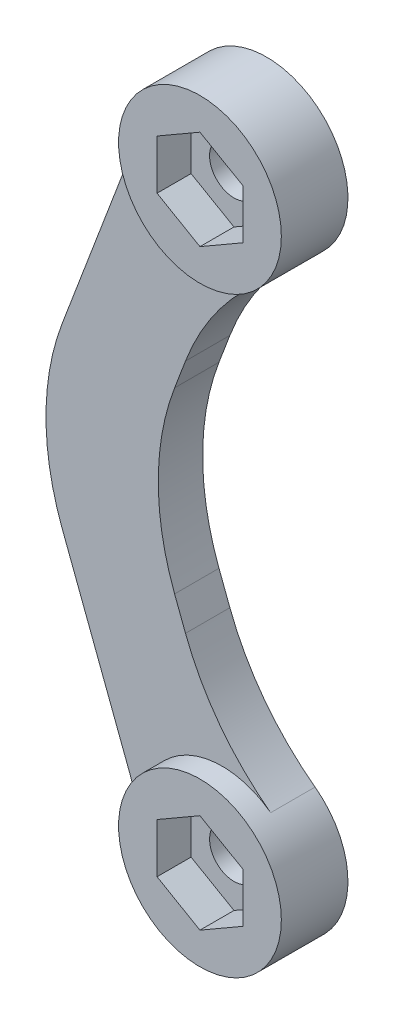
ISO-10303-21;
HEADER;
FILE_DESCRIPTION(('STEP AP214'),'2;1');
FILE_NAME('part.step','',(''),(''),'','','');
FILE_SCHEMA(('AUTOMOTIVE_DESIGN { 1 0 10303 214 1 1 1 1 }'));
ENDSEC;
DATA;
#1=APPLICATION_CONTEXT('core data for automotive mechanical design processes');
#2=APPLICATION_PROTOCOL_DEFINITION('international standard','automotive_design',2000,#1);
#3=PRODUCT_CONTEXT('',#1,'mechanical');
#4=PRODUCT('Part','Part','',(#3));
#5=PRODUCT_RELATED_PRODUCT_CATEGORY('part','',(#4));
#6=PRODUCT_DEFINITION_FORMATION('','',#4);
#7=PRODUCT_DEFINITION_CONTEXT('part definition',#1,'design');
#8=PRODUCT_DEFINITION('design','',#6,#7);
#9=PRODUCT_DEFINITION_SHAPE('','',#8);
#10=(LENGTH_UNIT() NAMED_UNIT(*) SI_UNIT(.MILLI.,.METRE.));
#11=(NAMED_UNIT(*) PLANE_ANGLE_UNIT() SI_UNIT($,.RADIAN.));
#12=(NAMED_UNIT(*) SI_UNIT($,.STERADIAN.) SOLID_ANGLE_UNIT());
#13=UNCERTAINTY_MEASURE_WITH_UNIT(LENGTH_MEASURE(1.E-05),#10,'distance_accuracy_value','');
#14=(GEOMETRIC_REPRESENTATION_CONTEXT(3) GLOBAL_UNCERTAINTY_ASSIGNED_CONTEXT((#13)) GLOBAL_UNIT_ASSIGNED_CONTEXT((#10,
#11,#12)) REPRESENTATION_CONTEXT('',''));
#15=CARTESIAN_POINT('',(0.,0.,0.));
#16=DIRECTION('',(0.,0.,1.));
#17=DIRECTION('',(1.,0.,0.));
#18=AXIS2_PLACEMENT_3D('',#15,#16,#17);
#19=CARTESIAN_POINT('',(0.412251729944696,-21.2160709251314,3.));
#20=DIRECTION('',(0.,0.,-1.));
#21=DIRECTION('',(-1.,0.,0.));
#22=AXIS2_PLACEMENT_3D('',#19,#20,#21);
#23=CYLINDRICAL_SURFACE('',#22,1.65);
#24=CARTESIAN_POINT('',(0.412251729944696,-21.2160709251314,0.));
#25=DIRECTION('',(0.,0.,1.));
#26=DIRECTION('',(1.,0.,0.));
#27=AXIS2_PLACEMENT_3D('',#24,#25,#26);
#28=CIRCLE('',#27,1.65);
#29=CARTESIAN_POINT('',(2.06225172994469,-21.2160709251314,0.));
#30=VERTEX_POINT('',#29);
#31=EDGE_CURVE('E309',#30,#30,#28,.T.);
#32=ORIENTED_EDGE('',*,*,#31,.F.);
#33=EDGE_LOOP('',(#32));
#34=FACE_BOUND('',#33,.T.);
#35=CARTESIAN_POINT('',(0.412251729944696,-21.2160709251314,2.2));
#36=DIRECTION('',(0.,0.,1.));
#37=DIRECTION('',(1.,0.,0.));
#38=AXIS2_PLACEMENT_3D('',#35,#36,#37);
#39=CIRCLE('',#38,1.65);
#40=CARTESIAN_POINT('',(2.06225172994469,-21.2160709251314,2.2));
#41=VERTEX_POINT('',#40);
#42=EDGE_CURVE('E253',#41,#41,#39,.T.);
#43=ORIENTED_EDGE('',*,*,#42,.T.);
#44=EDGE_LOOP('',(#43));
#45=FACE_BOUND('',#44,.T.);
#46=ADVANCED_FACE('F35',(#34,#45),#23,.F.);
#47=CARTESIAN_POINT('',(0.412251729944696,18.7839290748686,3.));
#48=DIRECTION('',(0.,0.,-1.));
#49=DIRECTION('',(-1.,0.,0.));
#50=AXIS2_PLACEMENT_3D('',#47,#48,#49);
#51=CYLINDRICAL_SURFACE('',#50,1.65);
#52=CARTESIAN_POINT('',(0.412251729944696,18.7839290748686,0.));
#53=DIRECTION('',(0.,0.,1.));
#54=DIRECTION('',(-1.,0.,0.));
#55=AXIS2_PLACEMENT_3D('',#52,#53,#54);
#56=CIRCLE('',#55,1.65);
#57=CARTESIAN_POINT('',(-1.2377482700553,18.7839290748686,0.));
#58=VERTEX_POINT('',#57);
#59=EDGE_CURVE('E305',#58,#58,#56,.T.);
#60=ORIENTED_EDGE('',*,*,#59,.F.);
#61=EDGE_LOOP('',(#60));
#62=FACE_BOUND('',#61,.T.);
#63=CARTESIAN_POINT('',(0.412251729944696,18.7839290748686,2.2));
#64=DIRECTION('',(0.,0.,1.));
#65=DIRECTION('',(1.,0.,0.));
#66=AXIS2_PLACEMENT_3D('',#63,#64,#65);
#67=CIRCLE('',#66,1.65);
#68=CARTESIAN_POINT('',(2.06225172994469,18.7839290748686,2.2));
#69=VERTEX_POINT('',#68);
#70=EDGE_CURVE('E235',#69,#69,#67,.T.);
#71=ORIENTED_EDGE('',*,*,#70,.T.);
#72=EDGE_LOOP('',(#71));
#73=FACE_BOUND('',#72,.T.);
#74=ADVANCED_FACE('F457',(#62,#73),#51,.F.);
#75=CARTESIAN_POINT('',(0.412251729944696,-21.2160709251314,3.));
#76=DIRECTION('',(0.,0.,-1.));
#77=DIRECTION('',(-1.,0.,0.));
#78=AXIS2_PLACEMENT_3D('',#75,#76,#77);
#79=PLANE('',#78);
#80=DIRECTION('',(-0.354654234120539,-0.934997526317784,0.));
#81=VECTOR('',#80,1.);
#82=CARTESIAN_POINT('',(-5.0877482700553,18.7839290748686,3.));
#83=LINE('',#82,#81);
#84=CARTESIAN_POINT('',(-5.81281603394617,16.8723867882473,3.));
#85=VERTEX_POINT('',#84);
#86=CARTESIAN_POINT('',(-10.387046829347,4.81305105491778,3.));
#87=VERTEX_POINT('',#86);
#88=EDGE_CURVE('E313',#85,#87,#83,.T.);
#89=ORIENTED_EDGE('',*,*,#88,.T.);
#90=CARTESIAN_POINT('',(5.50791111805531,-1.21607092513137,3.));
#91=DIRECTION('',(0.,0.,-1.));
#92=DIRECTION('',(-1.,0.,0.));
#93=AXIS2_PLACEMENT_3D('',#90,#91,#92);
#94=CIRCLE('',#93,17.);
#95=CARTESIAN_POINT('',(-10.387046829347,-7.24519290518052,3.));
#96=VERTEX_POINT('',#95);
#97=EDGE_CURVE('E376',#87,#96,#94,.F.);
#98=ORIENTED_EDGE('',*,*,#97,.T.);
#99=DIRECTION('',(0.354654234120539,-0.934997526317784,0.));
#100=VECTOR('',#99,1.);
#101=CARTESIAN_POINT('',(-5.0877482700553,-21.2160709251314,3.));
#102=LINE('',#101,#100);
#103=CARTESIAN_POINT('',(-5.81281603394617,-19.30452863851,3.));
#104=VERTEX_POINT('',#103);
#105=EDGE_CURVE('E316',#96,#104,#102,.T.);
#106=ORIENTED_EDGE('',*,*,#105,.T.);
#107=CARTESIAN_POINT('',(-21.7077739813485,-25.3336506185592,3.));
#108=DIRECTION('',(0.,0.,-1.));
#109=DIRECTION('',(-1.,0.,0.));
#110=AXIS2_PLACEMENT_3D('',#107,#108,#109);
#111=CIRCLE('',#110,17.);
#112=CARTESIAN_POINT('',(-4.99486566614917,-22.222590405747,3.));
#113=VERTEX_POINT('',#112);
#114=EDGE_CURVE('E384',#104,#113,#111,.T.);
#115=ORIENTED_EDGE('',*,*,#114,.T.);
#116=CARTESIAN_POINT('',(0.412251729944704,-21.2160709251314,3.));
#117=DIRECTION('',(0.,0.,1.));
#118=DIRECTION('',(1.,0.,0.));
#119=AXIS2_PLACEMENT_3D('',#116,#117,#118);
#120=CIRCLE('',#119,5.49999999999999);
#121=CARTESIAN_POINT('',(3.69195873310707,-16.800924044969,3.));
#122=VERTEX_POINT('',#121);
#123=EDGE_CURVE('E301',#122,#113,#120,.T.);
#124=ORIENTED_EDGE('',*,*,#123,.F.);
#125=CARTESIAN_POINT('',(13.8292349246999,-3.15410641537616,3.));
#126=DIRECTION('',(0.,0.,-1.));
#127=DIRECTION('',(-1.,0.,0.));
#128=AXIS2_PLACEMENT_3D('',#125,#126,#127);
#129=CIRCLE('',#128,17.);
#130=CARTESIAN_POINT('',(-2.06572302270243,-9.18322839542531,3.));
#131=VERTEX_POINT('',#130);
#132=EDGE_CURVE('E389',#122,#131,#129,.T.);
#133=ORIENTED_EDGE('',*,*,#132,.T.);
#134=DIRECTION('',(-0.354654234120539,0.934997526317784,0.));
#135=VECTOR('',#134,1.);
#136=CARTESIAN_POINT('',(-5.0877482700553,-1.21607092513137,3.));
#137=LINE('',#136,#135);
#138=CARTESIAN_POINT('',(-2.80083993279528,-7.24519290518053,3.));
#139=VERTEX_POINT('',#138);
#140=EDGE_CURVE('E320',#131,#139,#137,.T.);
#141=ORIENTED_EDGE('',*,*,#140,.T.);
#142=CARTESIAN_POINT('',(13.094118014607,-1.21607092513137,3.));
#143=DIRECTION('',(0.,0.,-1.));
#144=DIRECTION('',(-1.,0.,0.));
#145=AXIS2_PLACEMENT_3D('',#142,#143,#144);
#146=CIRCLE('',#145,17.);
#147=CARTESIAN_POINT('',(-2.80083993279528,4.81305105491778,3.));
#148=VERTEX_POINT('',#147);
#149=EDGE_CURVE('E11',#139,#148,#146,.T.);
#150=ORIENTED_EDGE('',*,*,#149,.T.);
#151=DIRECTION('',(0.354654234120539,0.934997526317784,0.));
#152=VECTOR('',#151,1.);
#153=CARTESIAN_POINT('',(-5.0877482700553,-1.21607092513137,3.));
#154=LINE('',#153,#152);
#155=CARTESIAN_POINT('',(-2.06572302270243,6.75108654516257,3.));
#156=VERTEX_POINT('',#155);
#157=EDGE_CURVE('E322',#148,#156,#154,.T.);
#158=ORIENTED_EDGE('',*,*,#157,.T.);
#159=CARTESIAN_POINT('',(13.8292349246999,0.721964565113415,3.));
#160=DIRECTION('',(0.,0.,-1.));
#161=DIRECTION('',(-1.,0.,0.));
#162=AXIS2_PLACEMENT_3D('',#159,#160,#161);
#163=CIRCLE('',#162,17.);
#164=CARTESIAN_POINT('',(3.69195873310707,14.3687821947062,3.));
#165=VERTEX_POINT('',#164);
#166=EDGE_CURVE('E393',#156,#165,#163,.T.);
#167=ORIENTED_EDGE('',*,*,#166,.T.);
#168=CARTESIAN_POINT('',(0.412251729944697,18.7839290748686,3.));
#169=DIRECTION('',(0.,0.,1.));
#170=DIRECTION('',(1.,0.,0.));
#171=AXIS2_PLACEMENT_3D('',#168,#169,#170);
#172=CIRCLE('',#171,5.5);
#173=CARTESIAN_POINT('',(-4.99486566614919,19.7904485554843,3.));
#174=VERTEX_POINT('',#173);
#175=EDGE_CURVE('E271',#174,#165,#172,.T.);
#176=ORIENTED_EDGE('',*,*,#175,.F.);
#177=CARTESIAN_POINT('',(-21.7077739813485,22.9015087682964,3.));
#178=DIRECTION('',(0.,0.,-1.));
#179=DIRECTION('',(-1.,0.,0.));
#180=AXIS2_PLACEMENT_3D('',#177,#178,#179);
#181=CIRCLE('',#180,17.);
#182=EDGE_CURVE('E380',#174,#85,#181,.T.);
#183=ORIENTED_EDGE('',*,*,#182,.T.);
#184=EDGE_LOOP('',(#89,#98,#106,#115,#124,#133,#141,#150,#158,#167,#176,#183));
#185=FACE_BOUND('',#184,.T.);
#186=ADVANCED_FACE('F411',(#185),#79,.F.);
#187=CARTESIAN_POINT('',(0.412251729944696,-21.2160709251314,0.));
#188=DIRECTION('',(0.,0.,-1.));
#189=DIRECTION('',(-1.,0.,0.));
#190=AXIS2_PLACEMENT_3D('',#187,#188,#189);
#191=PLANE('',#190);
#192=ORIENTED_EDGE('',*,*,#31,.T.);
#193=EDGE_LOOP('',(#192));
#194=FACE_BOUND('',#193,.T.);
#195=DIRECTION('',(0.354654234120539,-0.934997526317784,0.));
#196=VECTOR('',#195,1.);
#197=CARTESIAN_POINT('',(-5.0877482700553,-21.2160709251314,0.));
#198=LINE('',#197,#196);
#199=CARTESIAN_POINT('',(-10.387046829347,-7.24519290518052,0.));
#200=VERTEX_POINT('',#199);
#201=CARTESIAN_POINT('',(-5.81281603394617,-19.30452863851,0.));
#202=VERTEX_POINT('',#201);
#203=EDGE_CURVE('E327',#200,#202,#198,.T.);
#204=ORIENTED_EDGE('',*,*,#203,.F.);
#205=CARTESIAN_POINT('',(5.50791111805531,-1.21607092513137,0.));
#206=DIRECTION('',(0.,0.,-1.));
#207=DIRECTION('',(-1.,0.,0.));
#208=AXIS2_PLACEMENT_3D('',#205,#206,#207);
#209=CIRCLE('',#208,17.);
#210=CARTESIAN_POINT('',(-10.387046829347,4.81305105491778,0.));
#211=VERTEX_POINT('',#210);
#212=EDGE_CURVE('E374',#200,#211,#209,.T.);
#213=ORIENTED_EDGE('',*,*,#212,.T.);
#214=DIRECTION('',(-0.354654234120539,-0.934997526317784,0.));
#215=VECTOR('',#214,1.);
#216=CARTESIAN_POINT('',(-5.0877482700553,18.7839290748686,0.));
#217=LINE('',#216,#215);
#218=CARTESIAN_POINT('',(-5.81281603394617,16.8723867882473,0.));
#219=VERTEX_POINT('',#218);
#220=EDGE_CURVE('E312',#219,#211,#217,.T.);
#221=ORIENTED_EDGE('',*,*,#220,.F.);
#222=CARTESIAN_POINT('',(-21.7077739813485,22.9015087682964,0.));
#223=DIRECTION('',(0.,0.,-1.));
#224=DIRECTION('',(-1.,0.,0.));
#225=AXIS2_PLACEMENT_3D('',#222,#223,#224);
#226=CIRCLE('',#225,17.);
#227=CARTESIAN_POINT('',(-4.99486566614919,19.7904485554843,0.));
#228=VERTEX_POINT('',#227);
#229=EDGE_CURVE('E378',#219,#228,#226,.F.);
#230=ORIENTED_EDGE('',*,*,#229,.T.);
#231=CARTESIAN_POINT('',(0.412251729944696,18.7839290748686,0.));
#232=DIRECTION('',(0.,0.,1.));
#233=DIRECTION('',(1.,0.,0.));
#234=AXIS2_PLACEMENT_3D('',#231,#232,#233);
#235=CIRCLE('',#234,5.5);
#236=CARTESIAN_POINT('',(3.69195873310707,14.3687821947062,0.));
#237=VERTEX_POINT('',#236);
#238=EDGE_CURVE('E317',#237,#228,#235,.T.);
#239=ORIENTED_EDGE('',*,*,#238,.F.);
#240=CARTESIAN_POINT('',(13.8292349246999,0.721964565113415,0.));
#241=DIRECTION('',(0.,0.,-1.));
#242=DIRECTION('',(-1.,0.,0.));
#243=AXIS2_PLACEMENT_3D('',#240,#241,#242);
#244=CIRCLE('',#243,17.);
#245=CARTESIAN_POINT('',(-2.06572302270243,6.75108654516257,0.));
#246=VERTEX_POINT('',#245);
#247=EDGE_CURVE('E391',#237,#246,#244,.F.);
#248=ORIENTED_EDGE('',*,*,#247,.T.);
#249=DIRECTION('',(0.354654234120539,0.934997526317784,0.));
#250=VECTOR('',#249,1.);
#251=CARTESIAN_POINT('',(-5.0877482700553,-1.21607092513137,0.));
#252=LINE('',#251,#250);
#253=CARTESIAN_POINT('',(-2.80083993279528,4.81305105491778,0.));
#254=VERTEX_POINT('',#253);
#255=EDGE_CURVE('E336',#254,#246,#252,.T.);
#256=ORIENTED_EDGE('',*,*,#255,.F.);
#257=CARTESIAN_POINT('',(13.094118014607,-1.21607092513137,0.));
#258=DIRECTION('',(0.,0.,-1.));
#259=DIRECTION('',(-1.,0.,0.));
#260=AXIS2_PLACEMENT_3D('',#257,#258,#259);
#261=CIRCLE('',#260,17.);
#262=CARTESIAN_POINT('',(-2.80083993279528,-7.24519290518053,0.));
#263=VERTEX_POINT('',#262);
#264=EDGE_CURVE('E43',#254,#263,#261,.F.);
#265=ORIENTED_EDGE('',*,*,#264,.T.);
#266=DIRECTION('',(-0.354654234120539,0.934997526317784,0.));
#267=VECTOR('',#266,1.);
#268=CARTESIAN_POINT('',(-5.0877482700553,-1.21607092513137,0.));
#269=LINE('',#268,#267);
#270=CARTESIAN_POINT('',(-2.06572302270243,-9.18322839542531,0.));
#271=VERTEX_POINT('',#270);
#272=EDGE_CURVE('E333',#271,#263,#269,.T.);
#273=ORIENTED_EDGE('',*,*,#272,.F.);
#274=CARTESIAN_POINT('',(13.8292349246999,-3.15410641537616,0.));
#275=DIRECTION('',(0.,0.,-1.));
#276=DIRECTION('',(-1.,0.,0.));
#277=AXIS2_PLACEMENT_3D('',#274,#275,#276);
#278=CIRCLE('',#277,17.);
#279=CARTESIAN_POINT('',(3.69195873310707,-16.800924044969,0.));
#280=VERTEX_POINT('',#279);
#281=EDGE_CURVE('E387',#271,#280,#278,.F.);
#282=ORIENTED_EDGE('',*,*,#281,.T.);
#283=CARTESIAN_POINT('',(0.412251729944696,-21.2160709251314,0.));
#284=DIRECTION('',(0.,0.,1.));
#285=DIRECTION('',(-1.,0.,0.));
#286=AXIS2_PLACEMENT_3D('',#283,#284,#285);
#287=CIRCLE('',#286,5.5);
#288=CARTESIAN_POINT('',(-4.99486566614919,-22.2225904057471,0.));
#289=VERTEX_POINT('',#288);
#290=EDGE_CURVE('E330',#289,#280,#287,.T.);
#291=ORIENTED_EDGE('',*,*,#290,.F.);
#292=CARTESIAN_POINT('',(-21.7077739813485,-25.3336506185592,0.));
#293=DIRECTION('',(0.,0.,-1.));
#294=DIRECTION('',(-1.,0.,0.));
#295=AXIS2_PLACEMENT_3D('',#292,#293,#294);
#296=CIRCLE('',#295,17.);
#297=EDGE_CURVE('E382',#289,#202,#296,.F.);
#298=ORIENTED_EDGE('',*,*,#297,.T.);
#299=EDGE_LOOP('',(#204,#213,#221,#230,#239,#248,#256,#265,#273,#282,#291,#298));
#300=FACE_BOUND('',#299,.T.);
#301=ORIENTED_EDGE('',*,*,#59,.T.);
#302=EDGE_LOOP('',(#301));
#303=FACE_BOUND('',#302,.T.);
#304=ADVANCED_FACE('F399',(#194,#300,#303),#191,.T.);
#305=CARTESIAN_POINT('',(-5.0877482700553,18.7839290748686,3.));
#306=DIRECTION('',(0.934997526317783,-0.354654234120539,0.));
#307=DIRECTION('',(0.354654234120539,0.934997526317784,0.));
#308=AXIS2_PLACEMENT_3D('',#305,#306,#307);
#309=PLANE('',#308);
#310=ORIENTED_EDGE('',*,*,#88,.F.);
#311=DIRECTION('',(0.,0.,1.));
#312=VECTOR('',#311,1.);
#313=CARTESIAN_POINT('',(-5.81281603394617,16.8723867882473,0.));
#314=LINE('',#313,#312);
#315=EDGE_CURVE('E345',#85,#219,#314,.F.);
#316=ORIENTED_EDGE('',*,*,#315,.T.);
#317=ORIENTED_EDGE('',*,*,#220,.T.);
#318=DIRECTION('',(0.,0.,-1.));
#319=VECTOR('',#318,1.);
#320=CARTESIAN_POINT('',(-10.387046829347,4.81305105491778,3.));
#321=LINE('',#320,#319);
#322=EDGE_CURVE('E324',#211,#87,#321,.F.);
#323=ORIENTED_EDGE('',*,*,#322,.T.);
#324=EDGE_LOOP('',(#310,#316,#317,#323));
#325=FACE_BOUND('',#324,.T.);
#326=ADVANCED_FACE('F427',(#325),#309,.F.);
#327=CARTESIAN_POINT('',(-5.0877482700553,-21.2160709251314,3.));
#328=DIRECTION('',(0.934997526317783,0.354654234120539,0.));
#329=DIRECTION('',(-0.354654234120539,0.934997526317784,0.));
#330=AXIS2_PLACEMENT_3D('',#327,#328,#329);
#331=PLANE('',#330);
#332=ORIENTED_EDGE('',*,*,#203,.T.);
#333=DIRECTION('',(0.,0.,1.));
#334=VECTOR('',#333,1.);
#335=CARTESIAN_POINT('',(-5.81281603394617,-19.30452863851,3.));
#336=LINE('',#335,#334);
#337=EDGE_CURVE('E363',#202,#104,#336,.T.);
#338=ORIENTED_EDGE('',*,*,#337,.T.);
#339=ORIENTED_EDGE('',*,*,#105,.F.);
#340=DIRECTION('',(0.,0.,-1.));
#341=VECTOR('',#340,1.);
#342=CARTESIAN_POINT('',(-10.387046829347,-7.24519290518053,3.));
#343=LINE('',#342,#341);
#344=EDGE_CURVE('E360',#96,#200,#343,.T.);
#345=ORIENTED_EDGE('',*,*,#344,.T.);
#346=EDGE_LOOP('',(#332,#338,#339,#345));
#347=FACE_BOUND('',#346,.T.);
#348=ADVANCED_FACE('F434',(#347),#331,.F.);
#349=CARTESIAN_POINT('',(0.412251729944696,-21.2160709251314,3.));
#350=DIRECTION('',(0.,0.,-1.));
#351=DIRECTION('',(-1.,0.,0.));
#352=AXIS2_PLACEMENT_3D('',#349,#350,#351);
#353=CYLINDRICAL_SURFACE('',#352,5.5);
#354=ORIENTED_EDGE('',*,*,#123,.T.);
#355=DIRECTION('',(0.,0.,-1.));
#356=VECTOR('',#355,1.);
#357=CARTESIAN_POINT('',(-4.99486566614919,-22.2225904057471,3.));
#358=LINE('',#357,#356);
#359=EDGE_CURVE('E357',#113,#289,#358,.T.);
#360=ORIENTED_EDGE('',*,*,#359,.T.);
#361=ORIENTED_EDGE('',*,*,#290,.T.);
#362=DIRECTION('',(0.,0.,-1.));
#363=VECTOR('',#362,1.);
#364=CARTESIAN_POINT('',(3.69195873310707,-16.800924044969,3.));
#365=LINE('',#364,#363);
#366=EDGE_CURVE('E354',#280,#122,#365,.F.);
#367=ORIENTED_EDGE('',*,*,#366,.T.);
#368=EDGE_LOOP('',(#354,#360,#361,#367));
#369=FACE_BOUND('',#368,.T.);
#370=CARTESIAN_POINT('',(0.412251729944704,-21.2160709251314,4.5));
#371=DIRECTION('',(0.,0.,1.));
#372=DIRECTION('',(1.,0.,0.));
#373=AXIS2_PLACEMENT_3D('',#370,#371,#372);
#374=CIRCLE('',#373,5.49999999999999);
#375=CARTESIAN_POINT('',(5.91225172994469,-21.2160709251314,4.5));
#376=VERTEX_POINT('',#375);
#377=EDGE_CURVE('E302',#376,#376,#374,.T.);
#378=ORIENTED_EDGE('',*,*,#377,.F.);
#379=EDGE_LOOP('',(#378));
#380=FACE_BOUND('',#379,.T.);
#381=ADVANCED_FACE('F442',(#369,#380),#353,.T.);
#382=CARTESIAN_POINT('',(-5.0877482700553,-1.21607092513137,3.));
#383=DIRECTION('',(-0.934997526317783,-0.354654234120538,0.));
#384=DIRECTION('',(0.354654234120538,-0.934997526317784,0.));
#385=AXIS2_PLACEMENT_3D('',#382,#383,#384);
#386=PLANE('',#385);
#387=ORIENTED_EDGE('',*,*,#140,.F.);
#388=DIRECTION('',(0.,0.,1.));
#389=VECTOR('',#388,1.);
#390=CARTESIAN_POINT('',(-2.06572302270243,-9.18322839542531,0.));
#391=LINE('',#390,#389);
#392=EDGE_CURVE('E367',#131,#271,#391,.F.);
#393=ORIENTED_EDGE('',*,*,#392,.T.);
#394=ORIENTED_EDGE('',*,*,#272,.T.);
#395=DIRECTION('',(0.,0.,-1.));
#396=VECTOR('',#395,1.);
#397=CARTESIAN_POINT('',(-2.80083993279528,-7.24519290518052,3.));
#398=LINE('',#397,#396);
#399=EDGE_CURVE('E365',#263,#139,#398,.F.);
#400=ORIENTED_EDGE('',*,*,#399,.T.);
#401=EDGE_LOOP('',(#387,#393,#394,#400));
#402=FACE_BOUND('',#401,.T.);
#403=ADVANCED_FACE('F406',(#402),#386,.F.);
#404=CARTESIAN_POINT('',(-5.0877482700553,-1.21607092513137,3.));
#405=DIRECTION('',(-0.934997526317783,0.354654234120538,0.));
#406=DIRECTION('',(-0.354654234120538,-0.934997526317784,0.));
#407=AXIS2_PLACEMENT_3D('',#404,#405,#406);
#408=PLANE('',#407);
#409=ORIENTED_EDGE('',*,*,#255,.T.);
#410=DIRECTION('',(0.,0.,1.));
#411=VECTOR('',#410,1.);
#412=CARTESIAN_POINT('',(-2.06572302270243,6.75108654516257,3.));
#413=LINE('',#412,#411);
#414=EDGE_CURVE('E50',#246,#156,#413,.T.);
#415=ORIENTED_EDGE('',*,*,#414,.T.);
#416=ORIENTED_EDGE('',*,*,#157,.F.);
#417=DIRECTION('',(0.,0.,-1.));
#418=VECTOR('',#417,1.);
#419=CARTESIAN_POINT('',(-2.80083993279528,4.81305105491778,0.));
#420=LINE('',#419,#418);
#421=EDGE_CURVE('E370',#148,#254,#420,.T.);
#422=ORIENTED_EDGE('',*,*,#421,.T.);
#423=EDGE_LOOP('',(#409,#415,#416,#422));
#424=FACE_BOUND('',#423,.T.);
#425=ADVANCED_FACE('F409',(#424),#408,.F.);
#426=CARTESIAN_POINT('',(0.412251729944696,18.7839290748686,3.));
#427=DIRECTION('',(0.,0.,-1.));
#428=DIRECTION('',(-1.,0.,0.));
#429=AXIS2_PLACEMENT_3D('',#426,#427,#428);
#430=CYLINDRICAL_SURFACE('',#429,5.5);
#431=ORIENTED_EDGE('',*,*,#238,.T.);
#432=DIRECTION('',(0.,0.,-1.));
#433=VECTOR('',#432,1.);
#434=CARTESIAN_POINT('',(-4.99486566614919,19.7904485554843,3.));
#435=LINE('',#434,#433);
#436=EDGE_CURVE('E351',#228,#174,#435,.F.);
#437=ORIENTED_EDGE('',*,*,#436,.T.);
#438=ORIENTED_EDGE('',*,*,#175,.T.);
#439=DIRECTION('',(0.,0.,-1.));
#440=VECTOR('',#439,1.);
#441=CARTESIAN_POINT('',(3.69195873310707,14.3687821947062,3.));
#442=LINE('',#441,#440);
#443=EDGE_CURVE('E348',#165,#237,#442,.T.);
#444=ORIENTED_EDGE('',*,*,#443,.T.);
#445=EDGE_LOOP('',(#431,#437,#438,#444));
#446=FACE_BOUND('',#445,.T.);
#447=CARTESIAN_POINT('',(0.412251729944697,18.7839290748686,4.5));
#448=DIRECTION('',(0.,0.,1.));
#449=DIRECTION('',(1.,0.,0.));
#450=AXIS2_PLACEMENT_3D('',#447,#448,#449);
#451=CIRCLE('',#450,5.5);
#452=CARTESIAN_POINT('',(5.91225172994469,18.7839290748686,4.5));
#453=VERTEX_POINT('',#452);
#454=EDGE_CURVE('E272',#453,#453,#451,.T.);
#455=ORIENTED_EDGE('',*,*,#454,.F.);
#456=EDGE_LOOP('',(#455));
#457=FACE_BOUND('',#456,.T.);
#458=ADVANCED_FACE('F417',(#446,#457),#430,.T.);
#459=CARTESIAN_POINT('',(0.412251729944704,-21.2160709251314,4.5));
#460=DIRECTION('',(0.,0.,1.));
#461=DIRECTION('',(1.,0.,0.));
#462=AXIS2_PLACEMENT_3D('',#459,#460,#461);
#463=PLANE('',#462);
#464=ORIENTED_EDGE('',*,*,#377,.T.);
#465=EDGE_LOOP('',(#464));
#466=FACE_BOUND('',#465,.T.);
#467=DIRECTION('',(0.,-1.,0.));
#468=VECTOR('',#467,1.);
#469=CARTESIAN_POINT('',(-2.48774827005529,-19.5417551444814,4.5));
#470=LINE('',#469,#468);
#471=CARTESIAN_POINT('',(-2.48774827005529,-19.5417551444814,4.5));
#472=VERTEX_POINT('',#471);
#473=CARTESIAN_POINT('',(-2.4877482700553,-22.8903867057813,4.5));
#474=VERTEX_POINT('',#473);
#475=EDGE_CURVE('E278',#472,#474,#470,.T.);
#476=ORIENTED_EDGE('',*,*,#475,.F.);
#477=DIRECTION('',(-0.866025403784442,-0.499999999999994,0.));
#478=VECTOR('',#477,1.);
#479=CARTESIAN_POINT('',(-2.48774827005529,-19.5417551444814,4.5));
#480=LINE('',#479,#478);
#481=CARTESIAN_POINT('',(0.412251729944717,-17.8674393638315,4.5));
#482=VERTEX_POINT('',#481);
#483=EDGE_CURVE('E275',#482,#472,#480,.T.);
#484=ORIENTED_EDGE('',*,*,#483,.F.);
#485=DIRECTION('',(-0.866025403784436,0.500000000000004,0.));
#486=VECTOR('',#485,1.);
#487=CARTESIAN_POINT('',(0.412251729944717,-17.8674393638315,4.5));
#488=LINE('',#487,#486);
#489=CARTESIAN_POINT('',(3.31225172994471,-19.5417551444815,4.5));
#490=VERTEX_POINT('',#489);
#491=EDGE_CURVE('E287',#490,#482,#488,.T.);
#492=ORIENTED_EDGE('',*,*,#491,.F.);
#493=DIRECTION('',(0.,1.,0.));
#494=VECTOR('',#493,1.);
#495=CARTESIAN_POINT('',(3.31225172994471,-19.5417551444815,4.5));
#496=LINE('',#495,#494);
#497=CARTESIAN_POINT('',(3.3122517299447,-22.8903867057813,4.5));
#498=VERTEX_POINT('',#497);
#499=EDGE_CURVE('E284',#498,#490,#496,.T.);
#500=ORIENTED_EDGE('',*,*,#499,.F.);
#501=DIRECTION('',(0.866025403784442,0.499999999999995,0.));
#502=VECTOR('',#501,1.);
#503=CARTESIAN_POINT('',(0.412251729944691,-24.5647024864312,4.5));
#504=LINE('',#503,#502);
#505=CARTESIAN_POINT('',(0.412251729944691,-24.5647024864312,4.5));
#506=VERTEX_POINT('',#505);
#507=EDGE_CURVE('E282',#506,#498,#504,.T.);
#508=ORIENTED_EDGE('',*,*,#507,.F.);
#509=DIRECTION('',(0.866025403784435,-0.500000000000007,0.));
#510=VECTOR('',#509,1.);
#511=CARTESIAN_POINT('',(-2.4877482700553,-22.8903867057813,4.5));
#512=LINE('',#511,#510);
#513=EDGE_CURVE('E280',#474,#506,#512,.T.);
#514=ORIENTED_EDGE('',*,*,#513,.F.);
#515=EDGE_LOOP('',(#476,#484,#492,#500,#508,#514));
#516=FACE_BOUND('',#515,.T.);
#517=ADVANCED_FACE('F476',(#466,#516),#463,.T.);
#518=CARTESIAN_POINT('',(-2.48774827005529,-19.5417551444814,4.5));
#519=DIRECTION('',(0.499999999999994,-0.866025403784442,0.));
#520=DIRECTION('',(0.866025403784442,0.499999999999994,0.));
#521=AXIS2_PLACEMENT_3D('',#518,#519,#520);
#522=PLANE('',#521);
#523=DIRECTION('',(0.,0.,-1.));
#524=VECTOR('',#523,1.);
#525=CARTESIAN_POINT('',(-2.48774827005529,-19.5417551444814,4.5));
#526=LINE('',#525,#524);
#527=CARTESIAN_POINT('',(-2.48774827005529,-19.5417551444814,2.2));
#528=VERTEX_POINT('',#527);
#529=EDGE_CURVE('E299',#472,#528,#526,.T.);
#530=ORIENTED_EDGE('',*,*,#529,.T.);
#531=DIRECTION('',(-0.866025403784442,-0.499999999999994,0.));
#532=VECTOR('',#531,1.);
#533=CARTESIAN_POINT('',(0.412251729944717,-17.8674393638315,2.2));
#534=LINE('',#533,#532);
#535=CARTESIAN_POINT('',(0.412251729944717,-17.8674393638315,2.2));
#536=VERTEX_POINT('',#535);
#537=EDGE_CURVE('E239',#536,#528,#534,.T.);
#538=ORIENTED_EDGE('',*,*,#537,.F.);
#539=DIRECTION('',(0.,0.,-1.));
#540=VECTOR('',#539,1.);
#541=CARTESIAN_POINT('',(0.412251729944717,-17.8674393638315,4.5));
#542=LINE('',#541,#540);
#543=EDGE_CURVE('E289',#482,#536,#542,.T.);
#544=ORIENTED_EDGE('',*,*,#543,.F.);
#545=ORIENTED_EDGE('',*,*,#483,.T.);
#546=EDGE_LOOP('',(#530,#538,#544,#545));
#547=FACE_BOUND('',#546,.T.);
#548=ADVANCED_FACE('F545',(#547),#522,.T.);
#549=CARTESIAN_POINT('',(-2.48774827005529,-19.5417551444814,4.5));
#550=DIRECTION('',(1.,0.,0.));
#551=DIRECTION('',(0.,1.,0.));
#552=AXIS2_PLACEMENT_3D('',#549,#550,#551);
#553=PLANE('',#552);
#554=DIRECTION('',(0.,0.,-1.));
#555=VECTOR('',#554,1.);
#556=CARTESIAN_POINT('',(-2.4877482700553,-22.8903867057813,4.5));
#557=LINE('',#556,#555);
#558=CARTESIAN_POINT('',(-2.4877482700553,-22.8903867057813,2.2));
#559=VERTEX_POINT('',#558);
#560=EDGE_CURVE('E297',#474,#559,#557,.T.);
#561=ORIENTED_EDGE('',*,*,#560,.T.);
#562=DIRECTION('',(0.,-1.,0.));
#563=VECTOR('',#562,1.);
#564=CARTESIAN_POINT('',(-2.48774827005529,-19.5417551444814,2.2));
#565=LINE('',#564,#563);
#566=EDGE_CURVE('E242',#528,#559,#565,.T.);
#567=ORIENTED_EDGE('',*,*,#566,.F.);
#568=ORIENTED_EDGE('',*,*,#529,.F.);
#569=ORIENTED_EDGE('',*,*,#475,.T.);
#570=EDGE_LOOP('',(#561,#567,#568,#569));
#571=FACE_BOUND('',#570,.T.);
#572=ADVANCED_FACE('F541',(#571),#553,.T.);
#573=CARTESIAN_POINT('',(-2.4877482700553,-22.8903867057813,4.5));
#574=DIRECTION('',(0.500000000000007,0.866025403784435,0.));
#575=DIRECTION('',(-0.866025403784434,0.500000000000007,0.));
#576=AXIS2_PLACEMENT_3D('',#573,#574,#575);
#577=PLANE('',#576);
#578=DIRECTION('',(0.,0.,-1.));
#579=VECTOR('',#578,1.);
#580=CARTESIAN_POINT('',(0.412251729944691,-24.5647024864312,4.5));
#581=LINE('',#580,#579);
#582=CARTESIAN_POINT('',(0.412251729944691,-24.5647024864312,2.2));
#583=VERTEX_POINT('',#582);
#584=EDGE_CURVE('E295',#506,#583,#581,.T.);
#585=ORIENTED_EDGE('',*,*,#584,.T.);
#586=DIRECTION('',(0.866025403784435,-0.500000000000007,0.));
#587=VECTOR('',#586,1.);
#588=CARTESIAN_POINT('',(-2.4877482700553,-22.8903867057813,2.2));
#589=LINE('',#588,#587);
#590=EDGE_CURVE('E245',#559,#583,#589,.T.);
#591=ORIENTED_EDGE('',*,*,#590,.F.);
#592=ORIENTED_EDGE('',*,*,#560,.F.);
#593=ORIENTED_EDGE('',*,*,#513,.T.);
#594=EDGE_LOOP('',(#585,#591,#592,#593));
#595=FACE_BOUND('',#594,.T.);
#596=ADVANCED_FACE('F537',(#595),#577,.T.);
#597=CARTESIAN_POINT('',(0.412251729944691,-24.5647024864312,4.5));
#598=DIRECTION('',(-0.499999999999995,0.866025403784442,0.));
#599=DIRECTION('',(-0.866025403784442,-0.499999999999995,0.));
#600=AXIS2_PLACEMENT_3D('',#597,#598,#599);
#601=PLANE('',#600);
#602=DIRECTION('',(0.,0.,-1.));
#603=VECTOR('',#602,1.);
#604=CARTESIAN_POINT('',(3.3122517299447,-22.8903867057813,4.5));
#605=LINE('',#604,#603);
#606=CARTESIAN_POINT('',(3.3122517299447,-22.8903867057813,2.2));
#607=VERTEX_POINT('',#606);
#608=EDGE_CURVE('E293',#498,#607,#605,.T.);
#609=ORIENTED_EDGE('',*,*,#608,.T.);
#610=DIRECTION('',(0.866025403784442,0.499999999999995,0.));
#611=VECTOR('',#610,1.);
#612=CARTESIAN_POINT('',(0.412251729944691,-24.5647024864312,2.2));
#613=LINE('',#612,#611);
#614=EDGE_CURVE('E225',#583,#607,#613,.T.);
#615=ORIENTED_EDGE('',*,*,#614,.F.);
#616=ORIENTED_EDGE('',*,*,#584,.F.);
#617=ORIENTED_EDGE('',*,*,#507,.T.);
#618=EDGE_LOOP('',(#609,#615,#616,#617));
#619=FACE_BOUND('',#618,.T.);
#620=ADVANCED_FACE('F533',(#619),#601,.T.);
#621=CARTESIAN_POINT('',(3.31225172994471,-19.5417551444815,4.5));
#622=DIRECTION('',(-1.,0.,0.));
#623=DIRECTION('',(0.,-1.,0.));
#624=AXIS2_PLACEMENT_3D('',#621,#622,#623);
#625=PLANE('',#624);
#626=DIRECTION('',(0.,0.,-1.));
#627=VECTOR('',#626,1.);
#628=CARTESIAN_POINT('',(3.31225172994471,-19.5417551444815,4.5));
#629=LINE('',#628,#627);
#630=CARTESIAN_POINT('',(3.31225172994471,-19.5417551444815,2.2));
#631=VERTEX_POINT('',#630);
#632=EDGE_CURVE('E291',#490,#631,#629,.T.);
#633=ORIENTED_EDGE('',*,*,#632,.T.);
#634=DIRECTION('',(0.,1.,0.));
#635=VECTOR('',#634,1.);
#636=CARTESIAN_POINT('',(3.3122517299447,-22.8903867057813,2.2));
#637=LINE('',#636,#635);
#638=EDGE_CURVE('E222',#607,#631,#637,.T.);
#639=ORIENTED_EDGE('',*,*,#638,.F.);
#640=ORIENTED_EDGE('',*,*,#608,.F.);
#641=ORIENTED_EDGE('',*,*,#499,.T.);
#642=EDGE_LOOP('',(#633,#639,#640,#641));
#643=FACE_BOUND('',#642,.T.);
#644=ADVANCED_FACE('F529',(#643),#625,.T.);
#645=CARTESIAN_POINT('',(0.412251729944717,-17.8674393638315,4.5));
#646=DIRECTION('',(-0.500000000000004,-0.866025403784436,0.));
#647=DIRECTION('',(0.866025403784436,-0.500000000000004,0.));
#648=AXIS2_PLACEMENT_3D('',#645,#646,#647);
#649=PLANE('',#648);
#650=ORIENTED_EDGE('',*,*,#543,.T.);
#651=DIRECTION('',(-0.866025403784436,0.500000000000004,0.));
#652=VECTOR('',#651,1.);
#653=CARTESIAN_POINT('',(3.31225172994471,-19.5417551444815,2.2));
#654=LINE('',#653,#652);
#655=EDGE_CURVE('E236',#631,#536,#654,.T.);
#656=ORIENTED_EDGE('',*,*,#655,.F.);
#657=ORIENTED_EDGE('',*,*,#632,.F.);
#658=ORIENTED_EDGE('',*,*,#491,.T.);
#659=EDGE_LOOP('',(#650,#656,#657,#658));
#660=FACE_BOUND('',#659,.T.);
#661=ADVANCED_FACE('F525',(#660),#649,.T.);
#662=CARTESIAN_POINT('',(0.412251729944697,18.7839290748686,4.5));
#663=DIRECTION('',(0.,0.,1.));
#664=DIRECTION('',(1.,0.,0.));
#665=AXIS2_PLACEMENT_3D('',#662,#663,#664);
#666=PLANE('',#665);
#667=ORIENTED_EDGE('',*,*,#454,.T.);
#668=EDGE_LOOP('',(#667));
#669=FACE_BOUND('',#668,.T.);
#670=DIRECTION('',(0.,-1.,0.));
#671=VECTOR('',#670,1.);
#672=CARTESIAN_POINT('',(-2.4877482700553,20.4582448555185,4.5));
#673=LINE('',#672,#671);
#674=CARTESIAN_POINT('',(-2.4877482700553,20.4582448555185,4.5));
#675=VERTEX_POINT('',#674);
#676=CARTESIAN_POINT('',(-2.4877482700553,17.1096132942187,4.5));
#677=VERTEX_POINT('',#676);
#678=EDGE_CURVE('E252',#675,#677,#673,.T.);
#679=ORIENTED_EDGE('',*,*,#678,.F.);
#680=DIRECTION('',(-0.866025403784437,-0.500000000000003,0.));
#681=VECTOR('',#680,1.);
#682=CARTESIAN_POINT('',(-2.4877482700553,20.4582448555185,4.5));
#683=LINE('',#682,#681);
#684=CARTESIAN_POINT('',(0.41225172994469,22.1325606361685,4.5));
#685=VERTEX_POINT('',#684);
#686=EDGE_CURVE('E250',#685,#675,#683,.T.);
#687=ORIENTED_EDGE('',*,*,#686,.F.);
#688=DIRECTION('',(-0.86602540378444,0.499999999999998,0.));
#689=VECTOR('',#688,1.);
#690=CARTESIAN_POINT('',(0.41225172994469,22.1325606361685,4.5));
#691=LINE('',#690,#689);
#692=CARTESIAN_POINT('',(3.31225172994469,20.4582448555186,4.5));
#693=VERTEX_POINT('',#692);
#694=EDGE_CURVE('E203',#693,#685,#691,.T.);
#695=ORIENTED_EDGE('',*,*,#694,.F.);
#696=DIRECTION('',(0.,1.,0.));
#697=VECTOR('',#696,1.);
#698=CARTESIAN_POINT('',(3.31225172994469,20.4582448555186,4.5));
#699=LINE('',#698,#697);
#700=CARTESIAN_POINT('',(3.31225172994469,17.1096132942187,4.5));
#701=VERTEX_POINT('',#700);
#702=EDGE_CURVE('E259',#701,#693,#699,.T.);
#703=ORIENTED_EDGE('',*,*,#702,.F.);
#704=DIRECTION('',(0.866025403784437,0.500000000000003,0.));
#705=VECTOR('',#704,1.);
#706=CARTESIAN_POINT('',(0.412251729944704,15.4352975135688,4.5));
#707=LINE('',#706,#705);
#708=CARTESIAN_POINT('',(0.412251729944704,15.4352975135688,4.5));
#709=VERTEX_POINT('',#708);
#710=EDGE_CURVE('E257',#709,#701,#707,.T.);
#711=ORIENTED_EDGE('',*,*,#710,.F.);
#712=DIRECTION('',(0.866025403784441,-0.499999999999995,0.));
#713=VECTOR('',#712,1.);
#714=CARTESIAN_POINT('',(-2.4877482700553,17.1096132942187,4.5));
#715=LINE('',#714,#713);
#716=EDGE_CURVE('E255',#677,#709,#715,.T.);
#717=ORIENTED_EDGE('',*,*,#716,.F.);
#718=EDGE_LOOP('',(#679,#687,#695,#703,#711,#717));
#719=FACE_BOUND('',#718,.T.);
#720=ADVANCED_FACE('F522',(#669,#719),#666,.T.);
#721=CARTESIAN_POINT('',(-2.4877482700553,20.4582448555185,4.5));
#722=DIRECTION('',(0.500000000000003,-0.866025403784437,0.));
#723=DIRECTION('',(0.866025403784437,0.500000000000003,0.));
#724=AXIS2_PLACEMENT_3D('',#721,#722,#723);
#725=PLANE('',#724);
#726=DIRECTION('',(0.,0.,-1.));
#727=VECTOR('',#726,1.);
#728=CARTESIAN_POINT('',(-2.4877482700553,20.4582448555185,4.5));
#729=LINE('',#728,#727);
#730=CARTESIAN_POINT('',(-2.4877482700553,20.4582448555185,2.2));
#731=VERTEX_POINT('',#730);
#732=EDGE_CURVE('E212',#675,#731,#729,.T.);
#733=ORIENTED_EDGE('',*,*,#732,.T.);
#734=DIRECTION('',(-0.866025403784437,-0.500000000000003,0.));
#735=VECTOR('',#734,1.);
#736=CARTESIAN_POINT('',(0.41225172994469,22.1325606361685,2.2));
#737=LINE('',#736,#735);
#738=CARTESIAN_POINT('',(0.41225172994469,22.1325606361685,2.2));
#739=VERTEX_POINT('',#738);
#740=EDGE_CURVE('E209',#739,#731,#737,.T.);
#741=ORIENTED_EDGE('',*,*,#740,.F.);
#742=DIRECTION('',(0.,0.,-1.));
#743=VECTOR('',#742,1.);
#744=CARTESIAN_POINT('',(0.41225172994469,22.1325606361685,4.5));
#745=LINE('',#744,#743);
#746=EDGE_CURVE('E196',#685,#739,#745,.T.);
#747=ORIENTED_EDGE('',*,*,#746,.F.);
#748=ORIENTED_EDGE('',*,*,#686,.T.);
#749=EDGE_LOOP('',(#733,#741,#747,#748));
#750=FACE_BOUND('',#749,.T.);
#751=ADVANCED_FACE('F210',(#750),#725,.T.);
#752=CARTESIAN_POINT('',(-2.4877482700553,20.4582448555185,4.5));
#753=DIRECTION('',(1.,0.,0.));
#754=DIRECTION('',(0.,1.,0.));
#755=AXIS2_PLACEMENT_3D('',#752,#753,#754);
#756=PLANE('',#755);
#757=DIRECTION('',(0.,0.,-1.));
#758=VECTOR('',#757,1.);
#759=CARTESIAN_POINT('',(-2.4877482700553,17.1096132942187,4.5));
#760=LINE('',#759,#758);
#761=CARTESIAN_POINT('',(-2.4877482700553,17.1096132942187,2.2));
#762=VERTEX_POINT('',#761);
#763=EDGE_CURVE('E268',#677,#762,#760,.T.);
#764=ORIENTED_EDGE('',*,*,#763,.T.);
#765=DIRECTION('',(0.,-1.,0.));
#766=VECTOR('',#765,1.);
#767=CARTESIAN_POINT('',(-2.4877482700553,20.4582448555185,2.2));
#768=LINE('',#767,#766);
#769=EDGE_CURVE('E216',#731,#762,#768,.T.);
#770=ORIENTED_EDGE('',*,*,#769,.F.);
#771=ORIENTED_EDGE('',*,*,#732,.F.);
#772=ORIENTED_EDGE('',*,*,#678,.T.);
#773=EDGE_LOOP('',(#764,#770,#771,#772));
#774=FACE_BOUND('',#773,.T.);
#775=ADVANCED_FACE('F515',(#774),#756,.T.);
#776=CARTESIAN_POINT('',(-2.4877482700553,17.1096132942187,4.5));
#777=DIRECTION('',(0.499999999999995,0.866025403784441,0.));
#778=DIRECTION('',(-0.866025403784441,0.499999999999995,0.));
#779=AXIS2_PLACEMENT_3D('',#776,#777,#778);
#780=PLANE('',#779);
#781=DIRECTION('',(0.,0.,-1.));
#782=VECTOR('',#781,1.);
#783=CARTESIAN_POINT('',(0.412251729944704,15.4352975135688,4.5));
#784=LINE('',#783,#782);
#785=CARTESIAN_POINT('',(0.412251729944704,15.4352975135688,2.2));
#786=VERTEX_POINT('',#785);
#787=EDGE_CURVE('E266',#709,#786,#784,.T.);
#788=ORIENTED_EDGE('',*,*,#787,.T.);
#789=DIRECTION('',(0.866025403784441,-0.499999999999995,0.));
#790=VECTOR('',#789,1.);
#791=CARTESIAN_POINT('',(-2.4877482700553,17.1096132942187,2.2));
#792=LINE('',#791,#790);
#793=EDGE_CURVE('E229',#762,#786,#792,.T.);
#794=ORIENTED_EDGE('',*,*,#793,.F.);
#795=ORIENTED_EDGE('',*,*,#763,.F.);
#796=ORIENTED_EDGE('',*,*,#716,.T.);
#797=EDGE_LOOP('',(#788,#794,#795,#796));
#798=FACE_BOUND('',#797,.T.);
#799=ADVANCED_FACE('F511',(#798),#780,.T.);
#800=CARTESIAN_POINT('',(0.412251729944704,15.4352975135688,4.5));
#801=DIRECTION('',(-0.500000000000003,0.866025403784437,0.));
#802=DIRECTION('',(-0.866025403784437,-0.500000000000003,0.));
#803=AXIS2_PLACEMENT_3D('',#800,#801,#802);
#804=PLANE('',#803);
#805=DIRECTION('',(0.,0.,-1.));
#806=VECTOR('',#805,1.);
#807=CARTESIAN_POINT('',(3.31225172994469,17.1096132942187,4.5));
#808=LINE('',#807,#806);
#809=CARTESIAN_POINT('',(3.31225172994469,17.1096132942187,2.2));
#810=VERTEX_POINT('',#809);
#811=EDGE_CURVE('E264',#701,#810,#808,.T.);
#812=ORIENTED_EDGE('',*,*,#811,.T.);
#813=DIRECTION('',(0.866025403784437,0.500000000000003,0.));
#814=VECTOR('',#813,1.);
#815=CARTESIAN_POINT('',(0.412251729944704,15.4352975135688,2.2));
#816=LINE('',#815,#814);
#817=EDGE_CURVE('E232',#786,#810,#816,.T.);
#818=ORIENTED_EDGE('',*,*,#817,.F.);
#819=ORIENTED_EDGE('',*,*,#787,.F.);
#820=ORIENTED_EDGE('',*,*,#710,.T.);
#821=EDGE_LOOP('',(#812,#818,#819,#820));
#822=FACE_BOUND('',#821,.T.);
#823=ADVANCED_FACE('F507',(#822),#804,.T.);
#824=CARTESIAN_POINT('',(3.31225172994469,20.4582448555186,4.5));
#825=DIRECTION('',(-1.,0.,0.));
#826=DIRECTION('',(0.,-1.,0.));
#827=AXIS2_PLACEMENT_3D('',#824,#825,#826);
#828=PLANE('',#827);
#829=DIRECTION('',(0.,0.,-1.));
#830=VECTOR('',#829,1.);
#831=CARTESIAN_POINT('',(3.31225172994469,20.4582448555186,4.5));
#832=LINE('',#831,#830);
#833=CARTESIAN_POINT('',(3.31225172994469,20.4582448555186,2.2));
#834=VERTEX_POINT('',#833);
#835=EDGE_CURVE('E206',#693,#834,#832,.T.);
#836=ORIENTED_EDGE('',*,*,#835,.T.);
#837=DIRECTION('',(0.,1.,0.));
#838=VECTOR('',#837,1.);
#839=CARTESIAN_POINT('',(3.31225172994469,17.1096132942187,2.2));
#840=LINE('',#839,#838);
#841=EDGE_CURVE('E221',#810,#834,#840,.T.);
#842=ORIENTED_EDGE('',*,*,#841,.F.);
#843=ORIENTED_EDGE('',*,*,#811,.F.);
#844=ORIENTED_EDGE('',*,*,#702,.T.);
#845=EDGE_LOOP('',(#836,#842,#843,#844));
#846=FACE_BOUND('',#845,.T.);
#847=ADVANCED_FACE('F504',(#846),#828,.T.);
#848=CARTESIAN_POINT('',(0.41225172994469,22.1325606361685,4.5));
#849=DIRECTION('',(-0.499999999999998,-0.86602540378444,0.));
#850=DIRECTION('',(0.86602540378444,-0.499999999999998,0.));
#851=AXIS2_PLACEMENT_3D('',#848,#849,#850);
#852=PLANE('',#851);
#853=ORIENTED_EDGE('',*,*,#746,.T.);
#854=DIRECTION('',(-0.86602540378444,0.499999999999998,0.));
#855=VECTOR('',#854,1.);
#856=CARTESIAN_POINT('',(3.31225172994469,20.4582448555186,2.2));
#857=LINE('',#856,#855);
#858=EDGE_CURVE('E200',#834,#739,#857,.T.);
#859=ORIENTED_EDGE('',*,*,#858,.F.);
#860=ORIENTED_EDGE('',*,*,#835,.F.);
#861=ORIENTED_EDGE('',*,*,#694,.T.);
#862=EDGE_LOOP('',(#853,#859,#860,#861));
#863=FACE_BOUND('',#862,.T.);
#864=ADVANCED_FACE('F198',(#863),#852,.T.);
#865=CARTESIAN_POINT('',(0.,0.,2.2));
#866=DIRECTION('',(0.,0.,1.));
#867=DIRECTION('',(1.,0.,0.));
#868=AXIS2_PLACEMENT_3D('',#865,#866,#867);
#869=PLANE('',#868);
#870=ORIENTED_EDGE('',*,*,#70,.F.);
#871=EDGE_LOOP('',(#870));
#872=FACE_BOUND('',#871,.T.);
#873=ORIENTED_EDGE('',*,*,#858,.T.);
#874=ORIENTED_EDGE('',*,*,#740,.T.);
#875=ORIENTED_EDGE('',*,*,#769,.T.);
#876=ORIENTED_EDGE('',*,*,#793,.T.);
#877=ORIENTED_EDGE('',*,*,#817,.T.);
#878=ORIENTED_EDGE('',*,*,#841,.T.);
#879=EDGE_LOOP('',(#873,#874,#875,#876,#877,#878));
#880=FACE_BOUND('',#879,.T.);
#881=ADVANCED_FACE('F218',(#872,#880),#869,.T.);
#882=CARTESIAN_POINT('',(0.,0.,2.2));
#883=DIRECTION('',(0.,0.,1.));
#884=DIRECTION('',(1.,0.,0.));
#885=AXIS2_PLACEMENT_3D('',#882,#883,#884);
#886=PLANE('',#885);
#887=ORIENTED_EDGE('',*,*,#42,.F.);
#888=EDGE_LOOP('',(#887));
#889=FACE_BOUND('',#888,.T.);
#890=ORIENTED_EDGE('',*,*,#655,.T.);
#891=ORIENTED_EDGE('',*,*,#537,.T.);
#892=ORIENTED_EDGE('',*,*,#566,.T.);
#893=ORIENTED_EDGE('',*,*,#590,.T.);
#894=ORIENTED_EDGE('',*,*,#614,.T.);
#895=ORIENTED_EDGE('',*,*,#638,.T.);
#896=EDGE_LOOP('',(#890,#891,#892,#893,#894,#895));
#897=FACE_BOUND('',#896,.T.);
#898=ADVANCED_FACE('F488',(#889,#897),#886,.T.);
#899=CARTESIAN_POINT('',(-21.7077739813485,22.9015087682964,3.));
#900=DIRECTION('',(0.,0.,-1.));
#901=DIRECTION('',(-1.,0.,0.));
#902=AXIS2_PLACEMENT_3D('',#899,#900,#901);
#903=CYLINDRICAL_SURFACE('',#902,17.);
#904=ORIENTED_EDGE('',*,*,#182,.F.);
#905=ORIENTED_EDGE('',*,*,#436,.F.);
#906=ORIENTED_EDGE('',*,*,#229,.F.);
#907=ORIENTED_EDGE('',*,*,#315,.F.);
#908=EDGE_LOOP('',(#904,#905,#906,#907));
#909=FACE_BOUND('',#908,.T.);
#910=ADVANCED_FACE('F424',(#909),#903,.F.);
#911=CARTESIAN_POINT('',(-21.7077739813485,-25.3336506185592,3.));
#912=DIRECTION('',(0.,0.,-1.));
#913=DIRECTION('',(-1.,0.,0.));
#914=AXIS2_PLACEMENT_3D('',#911,#912,#913);
#915=CYLINDRICAL_SURFACE('',#914,17.);
#916=ORIENTED_EDGE('',*,*,#114,.F.);
#917=ORIENTED_EDGE('',*,*,#337,.F.);
#918=ORIENTED_EDGE('',*,*,#297,.F.);
#919=ORIENTED_EDGE('',*,*,#359,.F.);
#920=EDGE_LOOP('',(#916,#917,#918,#919));
#921=FACE_BOUND('',#920,.T.);
#922=ADVANCED_FACE('F440',(#921),#915,.F.);
#923=CARTESIAN_POINT('',(13.8292349246999,-3.15410641537616,3.));
#924=DIRECTION('',(0.,0.,-1.));
#925=DIRECTION('',(-1.,0.,0.));
#926=AXIS2_PLACEMENT_3D('',#923,#924,#925);
#927=CYLINDRICAL_SURFACE('',#926,17.);
#928=ORIENTED_EDGE('',*,*,#132,.F.);
#929=ORIENTED_EDGE('',*,*,#366,.F.);
#930=ORIENTED_EDGE('',*,*,#281,.F.);
#931=ORIENTED_EDGE('',*,*,#392,.F.);
#932=EDGE_LOOP('',(#928,#929,#930,#931));
#933=FACE_BOUND('',#932,.T.);
#934=ADVANCED_FACE('F447',(#933),#927,.F.);
#935=CARTESIAN_POINT('',(13.8292349246999,0.721964565113415,3.));
#936=DIRECTION('',(0.,0.,-1.));
#937=DIRECTION('',(-1.,0.,0.));
#938=AXIS2_PLACEMENT_3D('',#935,#936,#937);
#939=CYLINDRICAL_SURFACE('',#938,17.);
#940=ORIENTED_EDGE('',*,*,#166,.F.);
#941=ORIENTED_EDGE('',*,*,#414,.F.);
#942=ORIENTED_EDGE('',*,*,#247,.F.);
#943=ORIENTED_EDGE('',*,*,#443,.F.);
#944=EDGE_LOOP('',(#940,#941,#942,#943));
#945=FACE_BOUND('',#944,.T.);
#946=ADVANCED_FACE('F414',(#945),#939,.F.);
#947=CARTESIAN_POINT('',(13.094118014607,-1.21607092513137,3.));
#948=DIRECTION('',(0.,0.,1.));
#949=DIRECTION('',(1.,0.,0.));
#950=AXIS2_PLACEMENT_3D('',#947,#948,#949);
#951=CYLINDRICAL_SURFACE('',#950,17.);
#952=ORIENTED_EDGE('',*,*,#149,.F.);
#953=ORIENTED_EDGE('',*,*,#399,.F.);
#954=ORIENTED_EDGE('',*,*,#264,.F.);
#955=ORIENTED_EDGE('',*,*,#421,.F.);
#956=EDGE_LOOP('',(#952,#953,#954,#955));
#957=FACE_BOUND('',#956,.T.);
#958=ADVANCED_FACE('F408',(#957),#951,.F.);
#959=CARTESIAN_POINT('',(5.50791111805531,-1.21607092513137,3.));
#960=DIRECTION('',(0.,0.,-1.));
#961=DIRECTION('',(-1.,0.,0.));
#962=AXIS2_PLACEMENT_3D('',#959,#960,#961);
#963=CYLINDRICAL_SURFACE('',#962,17.);
#964=ORIENTED_EDGE('',*,*,#97,.F.);
#965=ORIENTED_EDGE('',*,*,#322,.F.);
#966=ORIENTED_EDGE('',*,*,#212,.F.);
#967=ORIENTED_EDGE('',*,*,#344,.F.);
#968=EDGE_LOOP('',(#964,#965,#966,#967));
#969=FACE_BOUND('',#968,.T.);
#970=ADVANCED_FACE('F37',(#969),#963,.T.);
#971=CLOSED_SHELL('',(#46,#74,#186,#304,#326,#348,#381,#403,#425,#458,#517,#548,#572,#596,#620,
#644,#661,#720,#751,#775,#799,#823,#847,#864,#881,#898,#910,#922,#934,#946,#958,#970));
#972=MANIFOLD_SOLID_BREP('B2',#971);
#973=ADVANCED_BREP_SHAPE_REPRESENTATION('',(#18,#972),#14);
#974=SHAPE_DEFINITION_REPRESENTATION(#9,#973);
ENDSEC;
END-ISO-10303-21;
